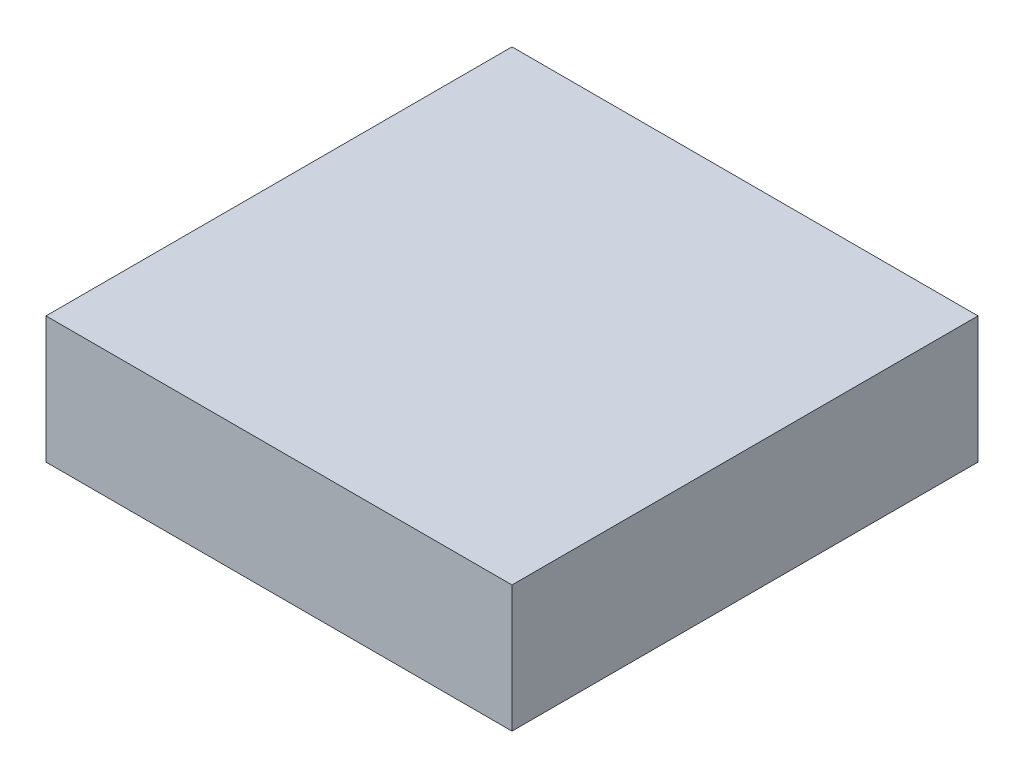
ISO-10303-21;
HEADER;
FILE_DESCRIPTION(('STEP AP214'),'2;1');
FILE_NAME('part.step','',(''),(''),'','','');
FILE_SCHEMA(('AUTOMOTIVE_DESIGN { 1 0 10303 214 1 1 1 1 }'));
ENDSEC;
DATA;
#1=APPLICATION_CONTEXT('core data for automotive mechanical design processes');
#2=APPLICATION_PROTOCOL_DEFINITION('international standard','automotive_design',2000,#1);
#3=PRODUCT_CONTEXT('',#1,'mechanical');
#4=PRODUCT('Part','Part','',(#3));
#5=PRODUCT_RELATED_PRODUCT_CATEGORY('part','',(#4));
#6=PRODUCT_DEFINITION_FORMATION('','',#4);
#7=PRODUCT_DEFINITION_CONTEXT('part definition',#1,'design');
#8=PRODUCT_DEFINITION('design','',#6,#7);
#9=PRODUCT_DEFINITION_SHAPE('','',#8);
#10=(LENGTH_UNIT() NAMED_UNIT(*) SI_UNIT(.MILLI.,.METRE.));
#11=(NAMED_UNIT(*) PLANE_ANGLE_UNIT() SI_UNIT($,.RADIAN.));
#12=(NAMED_UNIT(*) SI_UNIT($,.STERADIAN.) SOLID_ANGLE_UNIT());
#13=UNCERTAINTY_MEASURE_WITH_UNIT(LENGTH_MEASURE(1.E-05),#10,'distance_accuracy_value','');
#14=(GEOMETRIC_REPRESENTATION_CONTEXT(3) GLOBAL_UNCERTAINTY_ASSIGNED_CONTEXT((#13)) GLOBAL_UNIT_ASSIGNED_CONTEXT((#10,
#11,#12)) REPRESENTATION_CONTEXT('',''));
#15=CARTESIAN_POINT('',(0.,0.,0.));
#16=DIRECTION('',(0.,0.,1.));
#17=DIRECTION('',(1.,0.,0.));
#18=AXIS2_PLACEMENT_3D('',#15,#16,#17);
#19=CARTESIAN_POINT('',(0.,25.,0.));
#20=DIRECTION('',(1.,0.,0.));
#21=DIRECTION('',(0.,0.,-1.));
#22=AXIS2_PLACEMENT_3D('',#19,#20,#21);
#23=PLANE('',#22);
#24=DIRECTION('',(0.,0.,1.));
#25=VECTOR('',#24,1.);
#26=CARTESIAN_POINT('',(0.,0.,0.));
#27=LINE('',#26,#25);
#28=CARTESIAN_POINT('',(0.,0.,-92.));
#29=VERTEX_POINT('',#28);
#30=CARTESIAN_POINT('',(0.,0.,0.));
#31=VERTEX_POINT('',#30);
#32=EDGE_CURVE('E98',#29,#31,#27,.T.);
#33=ORIENTED_EDGE('',*,*,#32,.T.);
#34=DIRECTION('',(0.,-1.,0.));
#35=VECTOR('',#34,1.);
#36=CARTESIAN_POINT('',(0.,25.,0.));
#37=LINE('',#36,#35);
#38=CARTESIAN_POINT('',(0.,25.,0.));
#39=VERTEX_POINT('',#38);
#40=EDGE_CURVE('E11',#39,#31,#37,.T.);
#41=ORIENTED_EDGE('',*,*,#40,.F.);
#42=DIRECTION('',(0.,0.,1.));
#43=VECTOR('',#42,1.);
#44=CARTESIAN_POINT('',(0.,25.,0.));
#45=LINE('',#44,#43);
#46=CARTESIAN_POINT('',(0.,25.,-92.));
#47=VERTEX_POINT('',#46);
#48=EDGE_CURVE('E86',#47,#39,#45,.T.);
#49=ORIENTED_EDGE('',*,*,#48,.F.);
#50=DIRECTION('',(0.,-1.,0.));
#51=VECTOR('',#50,1.);
#52=CARTESIAN_POINT('',(0.,25.,-92.));
#53=LINE('',#52,#51);
#54=EDGE_CURVE('E94',#47,#29,#53,.T.);
#55=ORIENTED_EDGE('',*,*,#54,.T.);
#56=EDGE_LOOP('',(#33,#41,#49,#55));
#57=FACE_BOUND('',#56,.T.);
#58=ADVANCED_FACE('F35',(#57),#23,.F.);
#59=CARTESIAN_POINT('',(0.,25.,0.));
#60=DIRECTION('',(0.,0.,-1.));
#61=DIRECTION('',(-1.,0.,0.));
#62=AXIS2_PLACEMENT_3D('',#59,#60,#61);
#63=PLANE('',#62);
#64=DIRECTION('',(1.,0.,0.));
#65=VECTOR('',#64,1.);
#66=CARTESIAN_POINT('',(0.,0.,0.));
#67=LINE('',#66,#65);
#68=CARTESIAN_POINT('',(92.,0.,0.));
#69=VERTEX_POINT('',#68);
#70=EDGE_CURVE('E90',#31,#69,#67,.T.);
#71=ORIENTED_EDGE('',*,*,#70,.T.);
#72=DIRECTION('',(0.,-1.,0.));
#73=VECTOR('',#72,1.);
#74=CARTESIAN_POINT('',(92.,25.,0.));
#75=LINE('',#74,#73);
#76=CARTESIAN_POINT('',(92.,25.,0.));
#77=VERTEX_POINT('',#76);
#78=EDGE_CURVE('E43',#77,#69,#75,.T.);
#79=ORIENTED_EDGE('',*,*,#78,.F.);
#80=DIRECTION('',(1.,0.,0.));
#81=VECTOR('',#80,1.);
#82=CARTESIAN_POINT('',(0.,25.,0.));
#83=LINE('',#82,#81);
#84=EDGE_CURVE('E81',#39,#77,#83,.T.);
#85=ORIENTED_EDGE('',*,*,#84,.F.);
#86=ORIENTED_EDGE('',*,*,#40,.T.);
#87=EDGE_LOOP('',(#71,#79,#85,#86));
#88=FACE_BOUND('',#87,.T.);
#89=ADVANCED_FACE('F89',(#88),#63,.F.);
#90=CARTESIAN_POINT('',(92.,25.,0.));
#91=DIRECTION('',(-1.,0.,0.));
#92=DIRECTION('',(0.,0.,1.));
#93=AXIS2_PLACEMENT_3D('',#90,#91,#92);
#94=PLANE('',#93);
#95=DIRECTION('',(0.,0.,-1.));
#96=VECTOR('',#95,1.);
#97=CARTESIAN_POINT('',(92.,0.,0.));
#98=LINE('',#97,#96);
#99=CARTESIAN_POINT('',(92.,0.,-92.));
#100=VERTEX_POINT('',#99);
#101=EDGE_CURVE('E68',#69,#100,#98,.T.);
#102=ORIENTED_EDGE('',*,*,#101,.T.);
#103=DIRECTION('',(0.,-1.,0.));
#104=VECTOR('',#103,1.);
#105=CARTESIAN_POINT('',(92.,25.,-92.));
#106=LINE('',#105,#104);
#107=CARTESIAN_POINT('',(92.,25.,-92.));
#108=VERTEX_POINT('',#107);
#109=EDGE_CURVE('E91',#108,#100,#106,.T.);
#110=ORIENTED_EDGE('',*,*,#109,.F.);
#111=DIRECTION('',(0.,0.,-1.));
#112=VECTOR('',#111,1.);
#113=CARTESIAN_POINT('',(92.,25.,0.));
#114=LINE('',#113,#112);
#115=EDGE_CURVE('E84',#77,#108,#114,.T.);
#116=ORIENTED_EDGE('',*,*,#115,.F.);
#117=ORIENTED_EDGE('',*,*,#78,.T.);
#118=EDGE_LOOP('',(#102,#110,#116,#117));
#119=FACE_BOUND('',#118,.T.);
#120=ADVANCED_FACE('F92',(#119),#94,.F.);
#121=CARTESIAN_POINT('',(0.,25.,-92.));
#122=DIRECTION('',(0.,0.,1.));
#123=DIRECTION('',(1.,0.,0.));
#124=AXIS2_PLACEMENT_3D('',#121,#122,#123);
#125=PLANE('',#124);
#126=DIRECTION('',(-1.,0.,0.));
#127=VECTOR('',#126,1.);
#128=CARTESIAN_POINT('',(0.,0.,-92.));
#129=LINE('',#128,#127);
#130=EDGE_CURVE('E74',#100,#29,#129,.T.);
#131=ORIENTED_EDGE('',*,*,#130,.T.);
#132=ORIENTED_EDGE('',*,*,#54,.F.);
#133=DIRECTION('',(-1.,0.,0.));
#134=VECTOR('',#133,1.);
#135=CARTESIAN_POINT('',(0.,25.,-92.));
#136=LINE('',#135,#134);
#137=EDGE_CURVE('E51',#108,#47,#136,.T.);
#138=ORIENTED_EDGE('',*,*,#137,.F.);
#139=ORIENTED_EDGE('',*,*,#109,.T.);
#140=EDGE_LOOP('',(#131,#132,#138,#139));
#141=FACE_BOUND('',#140,.T.);
#142=ADVANCED_FACE('F105',(#141),#125,.F.);
#143=CARTESIAN_POINT('',(0.,25.,0.));
#144=DIRECTION('',(0.,-1.,0.));
#145=DIRECTION('',(0.,0.,-1.));
#146=AXIS2_PLACEMENT_3D('',#143,#144,#145);
#147=PLANE('',#146);
#148=ORIENTED_EDGE('',*,*,#48,.T.);
#149=ORIENTED_EDGE('',*,*,#84,.T.);
#150=ORIENTED_EDGE('',*,*,#115,.T.);
#151=ORIENTED_EDGE('',*,*,#137,.T.);
#152=EDGE_LOOP('',(#148,#149,#150,#151));
#153=FACE_BOUND('',#152,.T.);
#154=ADVANCED_FACE('F82',(#153),#147,.F.);
#155=CARTESIAN_POINT('',(0.,0.,0.));
#156=DIRECTION('',(0.,-1.,0.));
#157=DIRECTION('',(0.,0.,-1.));
#158=AXIS2_PLACEMENT_3D('',#155,#156,#157);
#159=PLANE('',#158);
#160=ORIENTED_EDGE('',*,*,#32,.F.);
#161=ORIENTED_EDGE('',*,*,#130,.F.);
#162=ORIENTED_EDGE('',*,*,#101,.F.);
#163=ORIENTED_EDGE('',*,*,#70,.F.);
#164=EDGE_LOOP('',(#160,#161,#162,#163));
#165=FACE_BOUND('',#164,.T.);
#166=ADVANCED_FACE('F108',(#165),#159,.T.);
#167=CLOSED_SHELL('',(#58,#89,#120,#142,#154,#166));
#168=MANIFOLD_SOLID_BREP('B2',#167);
#169=ADVANCED_BREP_SHAPE_REPRESENTATION('',(#18,#168),#14);
#170=SHAPE_DEFINITION_REPRESENTATION(#9,#169);
ENDSEC;
END-ISO-10303-21;
